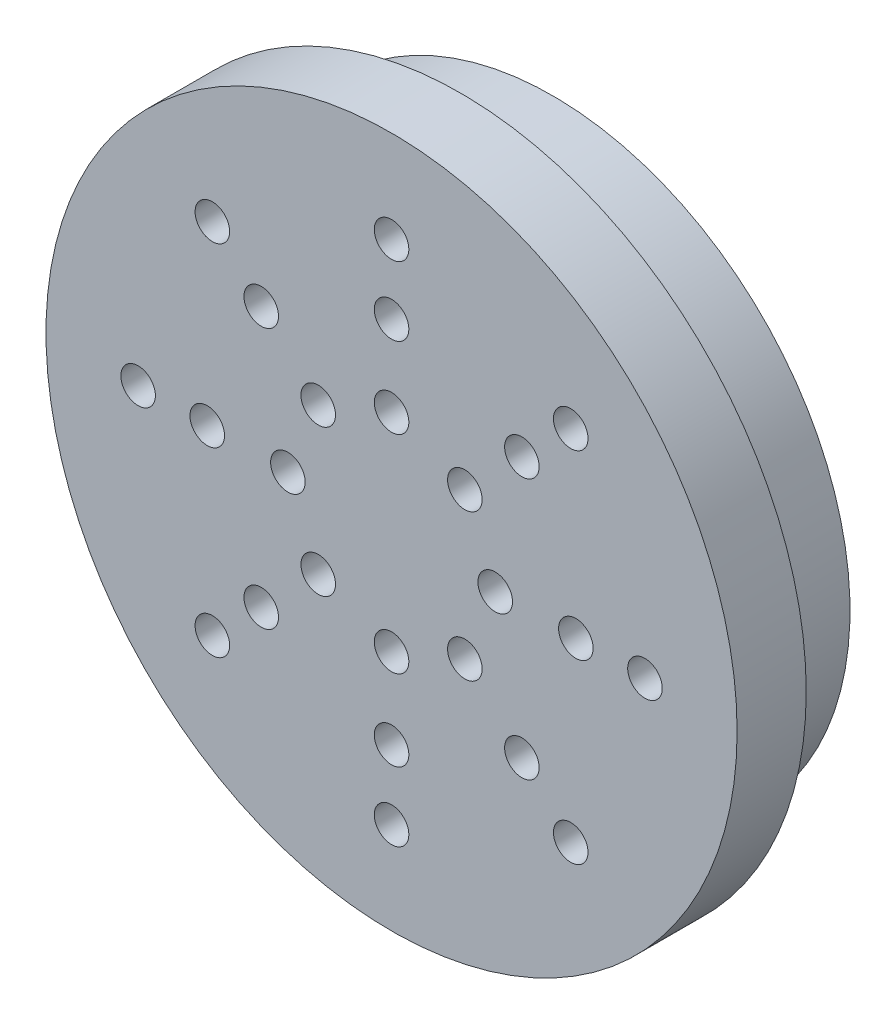
ISO-10303-21;
HEADER;
FILE_DESCRIPTION(('STEP AP214'),'2;1');
FILE_NAME('part.step','',(''),(''),'','','');
FILE_SCHEMA(('AUTOMOTIVE_DESIGN { 1 0 10303 214 1 1 1 1 }'));
ENDSEC;
DATA;
#1=APPLICATION_CONTEXT('core data for automotive mechanical design processes');
#2=APPLICATION_PROTOCOL_DEFINITION('international standard','automotive_design',2000,#1);
#3=PRODUCT_CONTEXT('',#1,'mechanical');
#4=PRODUCT('Part','Part','',(#3));
#5=PRODUCT_RELATED_PRODUCT_CATEGORY('part','',(#4));
#6=PRODUCT_DEFINITION_FORMATION('','',#4);
#7=PRODUCT_DEFINITION_CONTEXT('part definition',#1,'design');
#8=PRODUCT_DEFINITION('design','',#6,#7);
#9=PRODUCT_DEFINITION_SHAPE('','',#8);
#10=(LENGTH_UNIT() NAMED_UNIT(*) SI_UNIT(.MILLI.,.METRE.));
#11=(NAMED_UNIT(*) PLANE_ANGLE_UNIT() SI_UNIT($,.RADIAN.));
#12=(NAMED_UNIT(*) SI_UNIT($,.STERADIAN.) SOLID_ANGLE_UNIT());
#13=UNCERTAINTY_MEASURE_WITH_UNIT(LENGTH_MEASURE(1.E-05),#10,'distance_accuracy_value','');
#14=(GEOMETRIC_REPRESENTATION_CONTEXT(3) GLOBAL_UNCERTAINTY_ASSIGNED_CONTEXT((#13)) GLOBAL_UNIT_ASSIGNED_CONTEXT((#10,
#11,#12)) REPRESENTATION_CONTEXT('',''));
#15=CARTESIAN_POINT('',(0.,0.,0.));
#16=DIRECTION('',(0.,0.,1.));
#17=DIRECTION('',(1.,0.,0.));
#18=AXIS2_PLACEMENT_3D('',#15,#16,#17);
#19=CARTESIAN_POINT('',(0.,0.,3.));
#20=DIRECTION('',(0.,0.,-1.));
#21=DIRECTION('',(-1.,0.,0.));
#22=AXIS2_PLACEMENT_3D('',#19,#20,#21);
#23=CYLINDRICAL_SURFACE('',#22,15.);
#24=CARTESIAN_POINT('',(0.,0.,3.));
#25=DIRECTION('',(0.,0.,1.));
#26=DIRECTION('',(1.,0.,0.));
#27=AXIS2_PLACEMENT_3D('',#24,#25,#26);
#28=CIRCLE('',#27,15.);
#29=CARTESIAN_POINT('',(15.,0.,3.));
#30=VERTEX_POINT('',#29);
#31=EDGE_CURVE('E37',#30,#30,#28,.T.);
#32=ORIENTED_EDGE('',*,*,#31,.F.);
#33=EDGE_LOOP('',(#32));
#34=FACE_BOUND('',#33,.T.);
#35=CARTESIAN_POINT('',(0.,0.,0.));
#36=DIRECTION('',(0.,0.,1.));
#37=DIRECTION('',(1.,0.,0.));
#38=AXIS2_PLACEMENT_3D('',#35,#36,#37);
#39=CIRCLE('',#38,15.);
#40=CARTESIAN_POINT('',(15.,0.,0.));
#41=VERTEX_POINT('',#40);
#42=EDGE_CURVE('E33',#41,#41,#39,.T.);
#43=ORIENTED_EDGE('',*,*,#42,.T.);
#44=EDGE_LOOP('',(#43));
#45=FACE_BOUND('',#44,.T.);
#46=ADVANCED_FACE('F30',(#34,#45),#23,.T.);
#47=CARTESIAN_POINT('',(0.,0.,3.));
#48=DIRECTION('',(0.,0.,1.));
#49=DIRECTION('',(1.,0.,0.));
#50=AXIS2_PLACEMENT_3D('',#47,#48,#49);
#51=PLANE('',#50);
#52=CARTESIAN_POINT('',(-7.77817459305202,7.77817459305202,3.));
#53=DIRECTION('',(0.,0.,1.));
#54=DIRECTION('',(1.,0.,0.));
#55=AXIS2_PLACEMENT_3D('',#52,#53,#54);
#56=CIRCLE('',#55,0.749999999999998);
#57=CARTESIAN_POINT('',(-7.02817459305202,7.77817459305202,3.));
#58=VERTEX_POINT('',#57);
#59=EDGE_CURVE('E134',#58,#58,#56,.T.);
#60=ORIENTED_EDGE('',*,*,#59,.F.);
#61=EDGE_LOOP('',(#60));
#62=FACE_BOUND('',#61,.T.);
#63=CARTESIAN_POINT('',(0.,4.5,3.));
#64=DIRECTION('',(0.,0.,1.));
#65=DIRECTION('',(1.,0.,0.));
#66=AXIS2_PLACEMENT_3D('',#63,#64,#65);
#67=CIRCLE('',#66,0.75);
#68=CARTESIAN_POINT('',(0.75,4.5,3.));
#69=VERTEX_POINT('',#68);
#70=EDGE_CURVE('E127',#69,#69,#67,.T.);
#71=ORIENTED_EDGE('',*,*,#70,.F.);
#72=EDGE_LOOP('',(#71));
#73=FACE_BOUND('',#72,.T.);
#74=CARTESIAN_POINT('',(0.,8.,3.));
#75=DIRECTION('',(0.,0.,1.));
#76=DIRECTION('',(1.,0.,0.));
#77=AXIS2_PLACEMENT_3D('',#74,#75,#76);
#78=CIRCLE('',#77,0.75);
#79=CARTESIAN_POINT('',(0.749999999999999,8.,3.));
#80=VERTEX_POINT('',#79);
#81=EDGE_CURVE('E144',#80,#80,#78,.T.);
#82=ORIENTED_EDGE('',*,*,#81,.F.);
#83=EDGE_LOOP('',(#82));
#84=FACE_BOUND('',#83,.T.);
#85=CARTESIAN_POINT('',(0.,11.,3.));
#86=DIRECTION('',(0.,0.,1.));
#87=DIRECTION('',(1.,0.,0.));
#88=AXIS2_PLACEMENT_3D('',#85,#86,#87);
#89=CIRCLE('',#88,0.75);
#90=CARTESIAN_POINT('',(0.75,11.,3.));
#91=VERTEX_POINT('',#90);
#92=EDGE_CURVE('E66',#91,#91,#89,.T.);
#93=ORIENTED_EDGE('',*,*,#92,.F.);
#94=EDGE_LOOP('',(#93));
#95=FACE_BOUND('',#94,.T.);
#96=CARTESIAN_POINT('',(-5.65685424949238,5.65685424949238,3.));
#97=DIRECTION('',(0.,0.,1.));
#98=DIRECTION('',(1.,0.,0.));
#99=AXIS2_PLACEMENT_3D('',#96,#97,#98);
#100=CIRCLE('',#99,0.750000000000001);
#101=CARTESIAN_POINT('',(-4.90685424949238,5.65685424949238,3.));
#102=VERTEX_POINT('',#101);
#103=EDGE_CURVE('E103',#102,#102,#100,.T.);
#104=ORIENTED_EDGE('',*,*,#103,.F.);
#105=EDGE_LOOP('',(#104));
#106=FACE_BOUND('',#105,.T.);
#107=CARTESIAN_POINT('',(-3.18198051533946,3.18198051533946,3.));
#108=DIRECTION('',(0.,0.,1.));
#109=DIRECTION('',(1.,0.,0.));
#110=AXIS2_PLACEMENT_3D('',#107,#108,#109);
#111=CIRCLE('',#110,0.75);
#112=CARTESIAN_POINT('',(-2.43198051533946,3.18198051533946,3.));
#113=VERTEX_POINT('',#112);
#114=EDGE_CURVE('E110',#113,#113,#111,.T.);
#115=ORIENTED_EDGE('',*,*,#114,.F.);
#116=EDGE_LOOP('',(#115));
#117=FACE_BOUND('',#116,.T.);
#118=CARTESIAN_POINT('',(-11.,0.,3.));
#119=DIRECTION('',(0.,0.,1.));
#120=DIRECTION('',(1.,0.,0.));
#121=AXIS2_PLACEMENT_3D('',#118,#119,#120);
#122=CIRCLE('',#121,0.75);
#123=CARTESIAN_POINT('',(-10.25,0.,3.));
#124=VERTEX_POINT('',#123);
#125=EDGE_CURVE('E116',#124,#124,#122,.T.);
#126=ORIENTED_EDGE('',*,*,#125,.F.);
#127=EDGE_LOOP('',(#126));
#128=FACE_BOUND('',#127,.T.);
#129=CARTESIAN_POINT('',(-8.,0.,3.));
#130=DIRECTION('',(0.,0.,1.));
#131=DIRECTION('',(1.,0.,0.));
#132=AXIS2_PLACEMENT_3D('',#129,#130,#131);
#133=CIRCLE('',#132,0.749999999999998);
#134=CARTESIAN_POINT('',(-7.25,0.,3.));
#135=VERTEX_POINT('',#134);
#136=EDGE_CURVE('E122',#135,#135,#133,.T.);
#137=ORIENTED_EDGE('',*,*,#136,.F.);
#138=EDGE_LOOP('',(#137));
#139=FACE_BOUND('',#138,.T.);
#140=CARTESIAN_POINT('',(5.65685424949238,-5.65685424949238,3.));
#141=DIRECTION('',(0.,0.,1.));
#142=DIRECTION('',(1.,0.,0.));
#143=AXIS2_PLACEMENT_3D('',#140,#141,#142);
#144=CIRCLE('',#143,0.750000000000001);
#145=CARTESIAN_POINT('',(6.40685424949238,-5.65685424949238,3.));
#146=VERTEX_POINT('',#145);
#147=EDGE_CURVE('E79',#146,#146,#144,.T.);
#148=ORIENTED_EDGE('',*,*,#147,.F.);
#149=EDGE_LOOP('',(#148));
#150=FACE_BOUND('',#149,.T.);
#151=CARTESIAN_POINT('',(3.18198051533946,-3.18198051533946,3.));
#152=DIRECTION('',(0.,0.,1.));
#153=DIRECTION('',(1.,0.,0.));
#154=AXIS2_PLACEMENT_3D('',#151,#152,#153);
#155=CIRCLE('',#154,0.75);
#156=CARTESIAN_POINT('',(3.93198051533946,-3.18198051533946,3.));
#157=VERTEX_POINT('',#156);
#158=EDGE_CURVE('E86',#157,#157,#155,.T.);
#159=ORIENTED_EDGE('',*,*,#158,.F.);
#160=EDGE_LOOP('',(#159));
#161=FACE_BOUND('',#160,.T.);
#162=CARTESIAN_POINT('',(11.,0.,3.));
#163=DIRECTION('',(0.,0.,1.));
#164=DIRECTION('',(1.,0.,0.));
#165=AXIS2_PLACEMENT_3D('',#162,#163,#164);
#166=CIRCLE('',#165,0.75);
#167=CARTESIAN_POINT('',(11.75,0.,3.));
#168=VERTEX_POINT('',#167);
#169=EDGE_CURVE('E92',#168,#168,#166,.T.);
#170=ORIENTED_EDGE('',*,*,#169,.F.);
#171=EDGE_LOOP('',(#170));
#172=FACE_BOUND('',#171,.T.);
#173=CARTESIAN_POINT('',(8.,0.,3.));
#174=DIRECTION('',(0.,0.,1.));
#175=DIRECTION('',(1.,0.,0.));
#176=AXIS2_PLACEMENT_3D('',#173,#174,#175);
#177=CIRCLE('',#176,0.749999999999998);
#178=CARTESIAN_POINT('',(8.75,0.,3.));
#179=VERTEX_POINT('',#178);
#180=EDGE_CURVE('E98',#179,#179,#177,.T.);
#181=ORIENTED_EDGE('',*,*,#180,.F.);
#182=EDGE_LOOP('',(#181));
#183=FACE_BOUND('',#182,.T.);
#184=CARTESIAN_POINT('',(3.18198051533946,3.18198051533946,3.));
#185=DIRECTION('',(0.,0.,1.));
#186=DIRECTION('',(1.,0.,0.));
#187=AXIS2_PLACEMENT_3D('',#184,#185,#186);
#188=CIRCLE('',#187,0.75);
#189=CARTESIAN_POINT('',(3.93198051533946,3.18198051533946,3.));
#190=VERTEX_POINT('',#189);
#191=EDGE_CURVE('E60',#190,#190,#188,.T.);
#192=ORIENTED_EDGE('',*,*,#191,.F.);
#193=EDGE_LOOP('',(#192));
#194=FACE_BOUND('',#193,.T.);
#195=CARTESIAN_POINT('',(5.65685424949238,5.65685424949238,3.));
#196=DIRECTION('',(0.,0.,1.));
#197=DIRECTION('',(1.,0.,0.));
#198=AXIS2_PLACEMENT_3D('',#195,#196,#197);
#199=CIRCLE('',#198,0.749999999999998);
#200=CARTESIAN_POINT('',(6.40685424949238,5.65685424949238,3.));
#201=VERTEX_POINT('',#200);
#202=EDGE_CURVE('E53',#201,#201,#199,.T.);
#203=ORIENTED_EDGE('',*,*,#202,.F.);
#204=EDGE_LOOP('',(#203));
#205=FACE_BOUND('',#204,.T.);
#206=CARTESIAN_POINT('',(7.77817459305202,7.77817459305202,3.));
#207=DIRECTION('',(0.,0.,1.));
#208=DIRECTION('',(1.,0.,0.));
#209=AXIS2_PLACEMENT_3D('',#206,#207,#208);
#210=CIRCLE('',#209,0.75);
#211=CARTESIAN_POINT('',(8.52817459305202,7.77817459305202,3.));
#212=VERTEX_POINT('',#211);
#213=EDGE_CURVE('E74',#212,#212,#210,.T.);
#214=ORIENTED_EDGE('',*,*,#213,.F.);
#215=EDGE_LOOP('',(#214));
#216=FACE_BOUND('',#215,.T.);
#217=CARTESIAN_POINT('',(4.5,0.,3.));
#218=DIRECTION('',(0.,0.,1.));
#219=DIRECTION('',(1.,0.,0.));
#220=AXIS2_PLACEMENT_3D('',#217,#218,#219);
#221=CIRCLE('',#220,0.749999999999999);
#222=CARTESIAN_POINT('',(5.25,0.,3.));
#223=VERTEX_POINT('',#222);
#224=EDGE_CURVE('E67',#223,#223,#221,.T.);
#225=ORIENTED_EDGE('',*,*,#224,.F.);
#226=EDGE_LOOP('',(#225));
#227=FACE_BOUND('',#226,.T.);
#228=CARTESIAN_POINT('',(0.,-11.,3.));
#229=DIRECTION('',(0.,0.,1.));
#230=DIRECTION('',(1.,0.,0.));
#231=AXIS2_PLACEMENT_3D('',#228,#229,#230);
#232=CIRCLE('',#231,0.750000000000001);
#233=CARTESIAN_POINT('',(0.750000000000003,-11.,3.));
#234=VERTEX_POINT('',#233);
#235=EDGE_CURVE('E167',#234,#234,#232,.T.);
#236=ORIENTED_EDGE('',*,*,#235,.F.);
#237=EDGE_LOOP('',(#236));
#238=FACE_BOUND('',#237,.T.);
#239=CARTESIAN_POINT('',(0.,-8.,3.));
#240=DIRECTION('',(0.,0.,1.));
#241=DIRECTION('',(1.,0.,0.));
#242=AXIS2_PLACEMENT_3D('',#239,#240,#241);
#243=CIRCLE('',#242,0.75);
#244=CARTESIAN_POINT('',(0.750000000000001,-8.,3.));
#245=VERTEX_POINT('',#244);
#246=EDGE_CURVE('E185',#245,#245,#243,.T.);
#247=ORIENTED_EDGE('',*,*,#246,.F.);
#248=EDGE_LOOP('',(#247));
#249=FACE_BOUND('',#248,.T.);
#250=CARTESIAN_POINT('',(0.,-4.5,3.));
#251=DIRECTION('',(0.,0.,1.));
#252=DIRECTION('',(1.,0.,0.));
#253=AXIS2_PLACEMENT_3D('',#250,#251,#252);
#254=CIRCLE('',#253,0.75);
#255=CARTESIAN_POINT('',(0.750000000000001,-4.5,3.));
#256=VERTEX_POINT('',#255);
#257=EDGE_CURVE('E168',#256,#256,#254,.T.);
#258=ORIENTED_EDGE('',*,*,#257,.F.);
#259=EDGE_LOOP('',(#258));
#260=FACE_BOUND('',#259,.T.);
#261=CARTESIAN_POINT('',(7.77817459305202,-7.77817459305202,3.));
#262=DIRECTION('',(0.,0.,1.));
#263=DIRECTION('',(1.,0.,0.));
#264=AXIS2_PLACEMENT_3D('',#261,#262,#263);
#265=CIRCLE('',#264,0.749999999999998);
#266=CARTESIAN_POINT('',(8.52817459305202,-7.77817459305202,3.));
#267=VERTEX_POINT('',#266);
#268=EDGE_CURVE('E175',#267,#267,#265,.T.);
#269=ORIENTED_EDGE('',*,*,#268,.F.);
#270=EDGE_LOOP('',(#269));
#271=FACE_BOUND('',#270,.T.);
#272=CARTESIAN_POINT('',(-3.18198051533946,-3.18198051533946,3.));
#273=DIRECTION('',(0.,0.,1.));
#274=DIRECTION('',(1.,0.,0.));
#275=AXIS2_PLACEMENT_3D('',#272,#273,#274);
#276=CIRCLE('',#275,0.75);
#277=CARTESIAN_POINT('',(-2.43198051533946,-3.18198051533946,3.));
#278=VERTEX_POINT('',#277);
#279=EDGE_CURVE('E161',#278,#278,#276,.T.);
#280=ORIENTED_EDGE('',*,*,#279,.F.);
#281=EDGE_LOOP('',(#280));
#282=FACE_BOUND('',#281,.T.);
#283=CARTESIAN_POINT('',(-5.65685424949238,-5.65685424949238,3.));
#284=DIRECTION('',(0.,0.,1.));
#285=DIRECTION('',(1.,0.,0.));
#286=AXIS2_PLACEMENT_3D('',#283,#284,#285);
#287=CIRCLE('',#286,0.750000000000001);
#288=CARTESIAN_POINT('',(-4.90685424949238,-5.65685424949238,3.));
#289=VERTEX_POINT('',#288);
#290=EDGE_CURVE('E155',#289,#289,#287,.T.);
#291=ORIENTED_EDGE('',*,*,#290,.F.);
#292=EDGE_LOOP('',(#291));
#293=FACE_BOUND('',#292,.T.);
#294=CARTESIAN_POINT('',(-7.77817459305202,-7.77817459305202,3.));
#295=DIRECTION('',(0.,0.,1.));
#296=DIRECTION('',(1.,0.,0.));
#297=AXIS2_PLACEMENT_3D('',#294,#295,#296);
#298=CIRCLE('',#297,0.750000000000001);
#299=CARTESIAN_POINT('',(-7.02817459305202,-7.77817459305202,3.));
#300=VERTEX_POINT('',#299);
#301=EDGE_CURVE('E149',#300,#300,#298,.T.);
#302=ORIENTED_EDGE('',*,*,#301,.F.);
#303=EDGE_LOOP('',(#302));
#304=FACE_BOUND('',#303,.T.);
#305=CARTESIAN_POINT('',(-4.5,0.,3.));
#306=DIRECTION('',(0.,0.,1.));
#307=DIRECTION('',(1.,0.,0.));
#308=AXIS2_PLACEMENT_3D('',#305,#306,#307);
#309=CIRCLE('',#308,0.75);
#310=CARTESIAN_POINT('',(-3.75,0.,3.));
#311=VERTEX_POINT('',#310);
#312=EDGE_CURVE('E47',#311,#311,#309,.T.);
#313=ORIENTED_EDGE('',*,*,#312,.F.);
#314=EDGE_LOOP('',(#313));
#315=FACE_BOUND('',#314,.T.);
#316=ORIENTED_EDGE('',*,*,#31,.T.);
#317=EDGE_LOOP('',(#316));
#318=FACE_BOUND('',#317,.T.);
#319=ADVANCED_FACE('F202',(#62,#73,#84,#95,#106,#117,#128,#139,#150,#161,#172,#183,#194,#205,
#216,#227,#238,#249,#260,#271,#282,#293,#304,#315,#318),#51,.T.);
#320=CARTESIAN_POINT('',(0.,0.,0.));
#321=DIRECTION('',(0.,0.,1.));
#322=DIRECTION('',(1.,0.,0.));
#323=AXIS2_PLACEMENT_3D('',#320,#321,#322);
#324=PLANE('',#323);
#325=CARTESIAN_POINT('',(0.,0.,0.));
#326=DIRECTION('',(0.,0.,-1.));
#327=DIRECTION('',(-1.,0.,0.));
#328=AXIS2_PLACEMENT_3D('',#325,#326,#327);
#329=CIRCLE('',#328,12.9);
#330=CARTESIAN_POINT('',(-12.9,0.,0.));
#331=VERTEX_POINT('',#330);
#332=EDGE_CURVE('E10',#331,#331,#329,.T.);
#333=ORIENTED_EDGE('',*,*,#332,.F.);
#334=EDGE_LOOP('',(#333));
#335=FACE_BOUND('',#334,.T.);
#336=ORIENTED_EDGE('',*,*,#42,.F.);
#337=EDGE_LOOP('',(#336));
#338=FACE_BOUND('',#337,.T.);
#339=ADVANCED_FACE('F205',(#335,#338),#324,.F.);
#340=CARTESIAN_POINT('',(0.,0.,-4.));
#341=DIRECTION('',(0.,0.,1.));
#342=DIRECTION('',(1.,0.,0.));
#343=AXIS2_PLACEMENT_3D('',#340,#341,#342);
#344=CYLINDRICAL_SURFACE('',#343,12.9);
#345=CARTESIAN_POINT('',(0.,0.,-4.));
#346=DIRECTION('',(0.,0.,-1.));
#347=DIRECTION('',(-1.,0.,0.));
#348=AXIS2_PLACEMENT_3D('',#345,#346,#347);
#349=CIRCLE('',#348,12.9);
#350=CARTESIAN_POINT('',(-12.9,0.,-4.));
#351=VERTEX_POINT('',#350);
#352=EDGE_CURVE('E43',#351,#351,#349,.T.);
#353=ORIENTED_EDGE('',*,*,#352,.F.);
#354=EDGE_LOOP('',(#353));
#355=FACE_BOUND('',#354,.T.);
#356=ORIENTED_EDGE('',*,*,#332,.T.);
#357=EDGE_LOOP('',(#356));
#358=FACE_BOUND('',#357,.T.);
#359=ADVANCED_FACE('F228',(#355,#358),#344,.T.);
#360=CARTESIAN_POINT('',(0.,0.,-4.));
#361=DIRECTION('',(0.,0.,-1.));
#362=DIRECTION('',(-1.,0.,0.));
#363=AXIS2_PLACEMENT_3D('',#360,#361,#362);
#364=PLANE('',#363);
#365=CARTESIAN_POINT('',(-7.77817459305202,7.77817459305202,-4.));
#366=DIRECTION('',(0.,0.,1.));
#367=DIRECTION('',(1.,0.,0.));
#368=AXIS2_PLACEMENT_3D('',#365,#366,#367);
#369=CIRCLE('',#368,0.749999999999998);
#370=CARTESIAN_POINT('',(-7.02817459305202,7.77817459305202,-4.));
#371=VERTEX_POINT('',#370);
#372=EDGE_CURVE('E107',#371,#371,#369,.T.);
#373=ORIENTED_EDGE('',*,*,#372,.T.);
#374=EDGE_LOOP('',(#373));
#375=FACE_BOUND('',#374,.T.);
#376=CARTESIAN_POINT('',(0.,4.5,-4.));
#377=DIRECTION('',(0.,0.,1.));
#378=DIRECTION('',(1.,0.,0.));
#379=AXIS2_PLACEMENT_3D('',#376,#377,#378);
#380=CIRCLE('',#379,0.75);
#381=CARTESIAN_POINT('',(0.75,4.5,-4.));
#382=VERTEX_POINT('',#381);
#383=EDGE_CURVE('E130',#382,#382,#380,.T.);
#384=ORIENTED_EDGE('',*,*,#383,.T.);
#385=EDGE_LOOP('',(#384));
#386=FACE_BOUND('',#385,.T.);
#387=CARTESIAN_POINT('',(0.,8.,-4.));
#388=DIRECTION('',(0.,0.,1.));
#389=DIRECTION('',(1.,0.,0.));
#390=AXIS2_PLACEMENT_3D('',#387,#388,#389);
#391=CIRCLE('',#390,0.75);
#392=CARTESIAN_POINT('',(0.749999999999999,8.,-4.));
#393=VERTEX_POINT('',#392);
#394=EDGE_CURVE('E131',#393,#393,#391,.T.);
#395=ORIENTED_EDGE('',*,*,#394,.T.);
#396=EDGE_LOOP('',(#395));
#397=FACE_BOUND('',#396,.T.);
#398=CARTESIAN_POINT('',(0.,11.,-4.));
#399=DIRECTION('',(0.,0.,1.));
#400=DIRECTION('',(1.,0.,0.));
#401=AXIS2_PLACEMENT_3D('',#398,#399,#400);
#402=CIRCLE('',#401,0.75);
#403=CARTESIAN_POINT('',(0.75,11.,-4.));
#404=VERTEX_POINT('',#403);
#405=EDGE_CURVE('E141',#404,#404,#402,.T.);
#406=ORIENTED_EDGE('',*,*,#405,.T.);
#407=EDGE_LOOP('',(#406));
#408=FACE_BOUND('',#407,.T.);
#409=CARTESIAN_POINT('',(-5.65685424949238,5.65685424949238,-4.));
#410=DIRECTION('',(0.,0.,1.));
#411=DIRECTION('',(1.,0.,0.));
#412=AXIS2_PLACEMENT_3D('',#409,#410,#411);
#413=CIRCLE('',#412,0.750000000000001);
#414=CARTESIAN_POINT('',(-4.90685424949238,5.65685424949238,-4.));
#415=VERTEX_POINT('',#414);
#416=EDGE_CURVE('E106',#415,#415,#413,.T.);
#417=ORIENTED_EDGE('',*,*,#416,.T.);
#418=EDGE_LOOP('',(#417));
#419=FACE_BOUND('',#418,.T.);
#420=CARTESIAN_POINT('',(-3.18198051533946,3.18198051533946,-4.));
#421=DIRECTION('',(0.,0.,1.));
#422=DIRECTION('',(1.,0.,0.));
#423=AXIS2_PLACEMENT_3D('',#420,#421,#422);
#424=CIRCLE('',#423,0.75);
#425=CARTESIAN_POINT('',(-2.43198051533946,3.18198051533946,-4.));
#426=VERTEX_POINT('',#425);
#427=EDGE_CURVE('E113',#426,#426,#424,.T.);
#428=ORIENTED_EDGE('',*,*,#427,.T.);
#429=EDGE_LOOP('',(#428));
#430=FACE_BOUND('',#429,.T.);
#431=CARTESIAN_POINT('',(-11.,0.,-4.));
#432=DIRECTION('',(0.,0.,1.));
#433=DIRECTION('',(1.,0.,0.));
#434=AXIS2_PLACEMENT_3D('',#431,#432,#433);
#435=CIRCLE('',#434,0.75);
#436=CARTESIAN_POINT('',(-10.25,0.,-4.));
#437=VERTEX_POINT('',#436);
#438=EDGE_CURVE('E119',#437,#437,#435,.T.);
#439=ORIENTED_EDGE('',*,*,#438,.T.);
#440=EDGE_LOOP('',(#439));
#441=FACE_BOUND('',#440,.T.);
#442=CARTESIAN_POINT('',(-8.,0.,-4.));
#443=DIRECTION('',(0.,0.,1.));
#444=DIRECTION('',(1.,0.,0.));
#445=AXIS2_PLACEMENT_3D('',#442,#443,#444);
#446=CIRCLE('',#445,0.749999999999998);
#447=CARTESIAN_POINT('',(-7.25,0.,-4.));
#448=VERTEX_POINT('',#447);
#449=EDGE_CURVE('E50',#448,#448,#446,.T.);
#450=ORIENTED_EDGE('',*,*,#449,.T.);
#451=EDGE_LOOP('',(#450));
#452=FACE_BOUND('',#451,.T.);
#453=CARTESIAN_POINT('',(5.65685424949238,-5.65685424949238,-4.));
#454=DIRECTION('',(0.,0.,1.));
#455=DIRECTION('',(1.,0.,0.));
#456=AXIS2_PLACEMENT_3D('',#453,#454,#455);
#457=CIRCLE('',#456,0.750000000000001);
#458=CARTESIAN_POINT('',(6.40685424949238,-5.65685424949238,-4.));
#459=VERTEX_POINT('',#458);
#460=EDGE_CURVE('E82',#459,#459,#457,.T.);
#461=ORIENTED_EDGE('',*,*,#460,.T.);
#462=EDGE_LOOP('',(#461));
#463=FACE_BOUND('',#462,.T.);
#464=CARTESIAN_POINT('',(3.18198051533946,-3.18198051533946,-4.));
#465=DIRECTION('',(0.,0.,1.));
#466=DIRECTION('',(1.,0.,0.));
#467=AXIS2_PLACEMENT_3D('',#464,#465,#466);
#468=CIRCLE('',#467,0.75);
#469=CARTESIAN_POINT('',(3.93198051533946,-3.18198051533946,-4.));
#470=VERTEX_POINT('',#469);
#471=EDGE_CURVE('E89',#470,#470,#468,.T.);
#472=ORIENTED_EDGE('',*,*,#471,.T.);
#473=EDGE_LOOP('',(#472));
#474=FACE_BOUND('',#473,.T.);
#475=CARTESIAN_POINT('',(11.,0.,-4.));
#476=DIRECTION('',(0.,0.,1.));
#477=DIRECTION('',(1.,0.,0.));
#478=AXIS2_PLACEMENT_3D('',#475,#476,#477);
#479=CIRCLE('',#478,0.75);
#480=CARTESIAN_POINT('',(11.75,0.,-4.));
#481=VERTEX_POINT('',#480);
#482=EDGE_CURVE('E95',#481,#481,#479,.T.);
#483=ORIENTED_EDGE('',*,*,#482,.T.);
#484=EDGE_LOOP('',(#483));
#485=FACE_BOUND('',#484,.T.);
#486=CARTESIAN_POINT('',(8.,0.,-4.));
#487=DIRECTION('',(0.,0.,1.));
#488=DIRECTION('',(1.,0.,0.));
#489=AXIS2_PLACEMENT_3D('',#486,#487,#488);
#490=CIRCLE('',#489,0.749999999999998);
#491=CARTESIAN_POINT('',(8.75,0.,-4.));
#492=VERTEX_POINT('',#491);
#493=EDGE_CURVE('E71',#492,#492,#490,.T.);
#494=ORIENTED_EDGE('',*,*,#493,.T.);
#495=EDGE_LOOP('',(#494));
#496=FACE_BOUND('',#495,.T.);
#497=CARTESIAN_POINT('',(3.18198051533946,3.18198051533946,-4.));
#498=DIRECTION('',(0.,0.,1.));
#499=DIRECTION('',(1.,0.,0.));
#500=AXIS2_PLACEMENT_3D('',#497,#498,#499);
#501=CIRCLE('',#500,0.75);
#502=CARTESIAN_POINT('',(3.93198051533946,3.18198051533946,-4.));
#503=VERTEX_POINT('',#502);
#504=EDGE_CURVE('E63',#503,#503,#501,.T.);
#505=ORIENTED_EDGE('',*,*,#504,.T.);
#506=EDGE_LOOP('',(#505));
#507=FACE_BOUND('',#506,.T.);
#508=CARTESIAN_POINT('',(5.65685424949238,5.65685424949238,-4.));
#509=DIRECTION('',(0.,0.,1.));
#510=DIRECTION('',(1.,0.,0.));
#511=AXIS2_PLACEMENT_3D('',#508,#509,#510);
#512=CIRCLE('',#511,0.749999999999998);
#513=CARTESIAN_POINT('',(6.40685424949238,5.65685424949238,-4.));
#514=VERTEX_POINT('',#513);
#515=EDGE_CURVE('E56',#514,#514,#512,.T.);
#516=ORIENTED_EDGE('',*,*,#515,.T.);
#517=EDGE_LOOP('',(#516));
#518=FACE_BOUND('',#517,.T.);
#519=CARTESIAN_POINT('',(7.77817459305202,7.77817459305202,-4.));
#520=DIRECTION('',(0.,0.,1.));
#521=DIRECTION('',(1.,0.,0.));
#522=AXIS2_PLACEMENT_3D('',#519,#520,#521);
#523=CIRCLE('',#522,0.75);
#524=CARTESIAN_POINT('',(8.52817459305202,7.77817459305202,-4.));
#525=VERTEX_POINT('',#524);
#526=EDGE_CURVE('E57',#525,#525,#523,.T.);
#527=ORIENTED_EDGE('',*,*,#526,.T.);
#528=EDGE_LOOP('',(#527));
#529=FACE_BOUND('',#528,.T.);
#530=CARTESIAN_POINT('',(4.5,0.,-4.));
#531=DIRECTION('',(0.,0.,1.));
#532=DIRECTION('',(1.,0.,0.));
#533=AXIS2_PLACEMENT_3D('',#530,#531,#532);
#534=CIRCLE('',#533,0.749999999999999);
#535=CARTESIAN_POINT('',(5.25,0.,-4.));
#536=VERTEX_POINT('',#535);
#537=EDGE_CURVE('E70',#536,#536,#534,.T.);
#538=ORIENTED_EDGE('',*,*,#537,.T.);
#539=EDGE_LOOP('',(#538));
#540=FACE_BOUND('',#539,.T.);
#541=CARTESIAN_POINT('',(0.,-11.,-4.));
#542=DIRECTION('',(0.,0.,1.));
#543=DIRECTION('',(1.,0.,0.));
#544=AXIS2_PLACEMENT_3D('',#541,#542,#543);
#545=CIRCLE('',#544,0.750000000000001);
#546=CARTESIAN_POINT('',(0.750000000000003,-11.,-4.));
#547=VERTEX_POINT('',#546);
#548=EDGE_CURVE('E182',#547,#547,#545,.T.);
#549=ORIENTED_EDGE('',*,*,#548,.T.);
#550=EDGE_LOOP('',(#549));
#551=FACE_BOUND('',#550,.T.);
#552=CARTESIAN_POINT('',(0.,-8.,-4.));
#553=DIRECTION('',(0.,0.,1.));
#554=DIRECTION('',(1.,0.,0.));
#555=AXIS2_PLACEMENT_3D('',#552,#553,#554);
#556=CIRCLE('',#555,0.75);
#557=CARTESIAN_POINT('',(0.750000000000001,-8.,-4.));
#558=VERTEX_POINT('',#557);
#559=EDGE_CURVE('E172',#558,#558,#556,.T.);
#560=ORIENTED_EDGE('',*,*,#559,.T.);
#561=EDGE_LOOP('',(#560));
#562=FACE_BOUND('',#561,.T.);
#563=CARTESIAN_POINT('',(0.,-4.5,-4.));
#564=DIRECTION('',(0.,0.,1.));
#565=DIRECTION('',(1.,0.,0.));
#566=AXIS2_PLACEMENT_3D('',#563,#564,#565);
#567=CIRCLE('',#566,0.75);
#568=CARTESIAN_POINT('',(0.750000000000001,-4.5,-4.));
#569=VERTEX_POINT('',#568);
#570=EDGE_CURVE('E171',#569,#569,#567,.T.);
#571=ORIENTED_EDGE('',*,*,#570,.T.);
#572=EDGE_LOOP('',(#571));
#573=FACE_BOUND('',#572,.T.);
#574=CARTESIAN_POINT('',(7.77817459305202,-7.77817459305202,-4.));
#575=DIRECTION('',(0.,0.,1.));
#576=DIRECTION('',(1.,0.,0.));
#577=AXIS2_PLACEMENT_3D('',#574,#575,#576);
#578=CIRCLE('',#577,0.749999999999998);
#579=CARTESIAN_POINT('',(8.52817459305202,-7.77817459305202,-4.));
#580=VERTEX_POINT('',#579);
#581=EDGE_CURVE('E83',#580,#580,#578,.T.);
#582=ORIENTED_EDGE('',*,*,#581,.T.);
#583=EDGE_LOOP('',(#582));
#584=FACE_BOUND('',#583,.T.);
#585=CARTESIAN_POINT('',(-3.18198051533946,-3.18198051533946,-4.));
#586=DIRECTION('',(0.,0.,1.));
#587=DIRECTION('',(1.,0.,0.));
#588=AXIS2_PLACEMENT_3D('',#585,#586,#587);
#589=CIRCLE('',#588,0.75);
#590=CARTESIAN_POINT('',(-2.43198051533946,-3.18198051533946,-4.));
#591=VERTEX_POINT('',#590);
#592=EDGE_CURVE('E164',#591,#591,#589,.T.);
#593=ORIENTED_EDGE('',*,*,#592,.T.);
#594=EDGE_LOOP('',(#593));
#595=FACE_BOUND('',#594,.T.);
#596=CARTESIAN_POINT('',(-5.65685424949238,-5.65685424949238,-4.));
#597=DIRECTION('',(0.,0.,1.));
#598=DIRECTION('',(1.,0.,0.));
#599=AXIS2_PLACEMENT_3D('',#596,#597,#598);
#600=CIRCLE('',#599,0.750000000000001);
#601=CARTESIAN_POINT('',(-4.90685424949238,-5.65685424949238,-4.));
#602=VERTEX_POINT('',#601);
#603=EDGE_CURVE('E158',#602,#602,#600,.T.);
#604=ORIENTED_EDGE('',*,*,#603,.T.);
#605=EDGE_LOOP('',(#604));
#606=FACE_BOUND('',#605,.T.);
#607=CARTESIAN_POINT('',(-7.77817459305202,-7.77817459305202,-4.));
#608=DIRECTION('',(0.,0.,1.));
#609=DIRECTION('',(1.,0.,0.));
#610=AXIS2_PLACEMENT_3D('',#607,#608,#609);
#611=CIRCLE('',#610,0.750000000000001);
#612=CARTESIAN_POINT('',(-7.02817459305202,-7.77817459305202,-4.));
#613=VERTEX_POINT('',#612);
#614=EDGE_CURVE('E152',#613,#613,#611,.T.);
#615=ORIENTED_EDGE('',*,*,#614,.T.);
#616=EDGE_LOOP('',(#615));
#617=FACE_BOUND('',#616,.T.);
#618=CARTESIAN_POINT('',(-4.5,0.,-4.));
#619=DIRECTION('',(0.,0.,1.));
#620=DIRECTION('',(1.,0.,0.));
#621=AXIS2_PLACEMENT_3D('',#618,#619,#620);
#622=CIRCLE('',#621,0.75);
#623=CARTESIAN_POINT('',(-3.75,0.,-4.));
#624=VERTEX_POINT('',#623);
#625=EDGE_CURVE('E46',#624,#624,#622,.T.);
#626=ORIENTED_EDGE('',*,*,#625,.T.);
#627=EDGE_LOOP('',(#626));
#628=FACE_BOUND('',#627,.T.);
#629=ORIENTED_EDGE('',*,*,#352,.T.);
#630=EDGE_LOOP('',(#629));
#631=FACE_BOUND('',#630,.T.);
#632=ADVANCED_FACE('F191',(#375,#386,#397,#408,#419,#430,#441,#452,#463,#474,#485,#496,#507,
#518,#529,#540,#551,#562,#573,#584,#595,#606,#617,#628,#631),#364,.T.);
#633=CARTESIAN_POINT('',(-4.5,0.,-4.));
#634=DIRECTION('',(0.,0.,1.));
#635=DIRECTION('',(1.,0.,0.));
#636=AXIS2_PLACEMENT_3D('',#633,#634,#635);
#637=CYLINDRICAL_SURFACE('',#636,0.75);
#638=ORIENTED_EDGE('',*,*,#625,.F.);
#639=EDGE_LOOP('',(#638));
#640=FACE_BOUND('',#639,.T.);
#641=ORIENTED_EDGE('',*,*,#312,.T.);
#642=EDGE_LOOP('',(#641));
#643=FACE_BOUND('',#642,.T.);
#644=ADVANCED_FACE('F238',(#640,#643),#637,.F.);
#645=CARTESIAN_POINT('',(-7.77817459305202,-7.77817459305202,-4.));
#646=DIRECTION('',(0.,0.,1.));
#647=DIRECTION('',(1.,0.,0.));
#648=AXIS2_PLACEMENT_3D('',#645,#646,#647);
#649=CYLINDRICAL_SURFACE('',#648,0.750000000000001);
#650=ORIENTED_EDGE('',*,*,#614,.F.);
#651=EDGE_LOOP('',(#650));
#652=FACE_BOUND('',#651,.T.);
#653=ORIENTED_EDGE('',*,*,#301,.T.);
#654=EDGE_LOOP('',(#653));
#655=FACE_BOUND('',#654,.T.);
#656=ADVANCED_FACE('F242',(#652,#655),#649,.F.);
#657=CARTESIAN_POINT('',(-5.65685424949238,-5.65685424949238,-4.));
#658=DIRECTION('',(0.,0.,1.));
#659=DIRECTION('',(1.,0.,0.));
#660=AXIS2_PLACEMENT_3D('',#657,#658,#659);
#661=CYLINDRICAL_SURFACE('',#660,0.750000000000001);
#662=ORIENTED_EDGE('',*,*,#603,.F.);
#663=EDGE_LOOP('',(#662));
#664=FACE_BOUND('',#663,.T.);
#665=ORIENTED_EDGE('',*,*,#290,.T.);
#666=EDGE_LOOP('',(#665));
#667=FACE_BOUND('',#666,.T.);
#668=ADVANCED_FACE('F310',(#664,#667),#661,.F.);
#669=CARTESIAN_POINT('',(-3.18198051533946,-3.18198051533946,-4.));
#670=DIRECTION('',(0.,0.,1.));
#671=DIRECTION('',(1.,0.,0.));
#672=AXIS2_PLACEMENT_3D('',#669,#670,#671);
#673=CYLINDRICAL_SURFACE('',#672,0.75);
#674=ORIENTED_EDGE('',*,*,#592,.F.);
#675=EDGE_LOOP('',(#674));
#676=FACE_BOUND('',#675,.T.);
#677=ORIENTED_EDGE('',*,*,#279,.T.);
#678=EDGE_LOOP('',(#677));
#679=FACE_BOUND('',#678,.T.);
#680=ADVANCED_FACE('F314',(#676,#679),#673,.F.);
#681=CARTESIAN_POINT('',(7.77817459305202,-7.77817459305202,-4.));
#682=DIRECTION('',(0.,0.,1.));
#683=DIRECTION('',(1.,0.,0.));
#684=AXIS2_PLACEMENT_3D('',#681,#682,#683);
#685=CYLINDRICAL_SURFACE('',#684,0.749999999999998);
#686=ORIENTED_EDGE('',*,*,#581,.F.);
#687=EDGE_LOOP('',(#686));
#688=FACE_BOUND('',#687,.T.);
#689=ORIENTED_EDGE('',*,*,#268,.T.);
#690=EDGE_LOOP('',(#689));
#691=FACE_BOUND('',#690,.T.);
#692=ADVANCED_FACE('F318',(#688,#691),#685,.F.);
#693=CARTESIAN_POINT('',(0.,-4.5,-4.));
#694=DIRECTION('',(0.,0.,1.));
#695=DIRECTION('',(1.,0.,0.));
#696=AXIS2_PLACEMENT_3D('',#693,#694,#695);
#697=CYLINDRICAL_SURFACE('',#696,0.75);
#698=ORIENTED_EDGE('',*,*,#570,.F.);
#699=EDGE_LOOP('',(#698));
#700=FACE_BOUND('',#699,.T.);
#701=ORIENTED_EDGE('',*,*,#257,.T.);
#702=EDGE_LOOP('',(#701));
#703=FACE_BOUND('',#702,.T.);
#704=ADVANCED_FACE('F198',(#700,#703),#697,.F.);
#705=CARTESIAN_POINT('',(0.,-8.,-4.));
#706=DIRECTION('',(0.,0.,1.));
#707=DIRECTION('',(1.,0.,0.));
#708=AXIS2_PLACEMENT_3D('',#705,#706,#707);
#709=CYLINDRICAL_SURFACE('',#708,0.75);
#710=ORIENTED_EDGE('',*,*,#559,.F.);
#711=EDGE_LOOP('',(#710));
#712=FACE_BOUND('',#711,.T.);
#713=ORIENTED_EDGE('',*,*,#246,.T.);
#714=EDGE_LOOP('',(#713));
#715=FACE_BOUND('',#714,.T.);
#716=ADVANCED_FACE('F194',(#712,#715),#709,.F.);
#717=CARTESIAN_POINT('',(0.,-11.,-4.));
#718=DIRECTION('',(0.,0.,1.));
#719=DIRECTION('',(1.,0.,0.));
#720=AXIS2_PLACEMENT_3D('',#717,#718,#719);
#721=CYLINDRICAL_SURFACE('',#720,0.750000000000001);
#722=ORIENTED_EDGE('',*,*,#548,.F.);
#723=EDGE_LOOP('',(#722));
#724=FACE_BOUND('',#723,.T.);
#725=ORIENTED_EDGE('',*,*,#235,.T.);
#726=EDGE_LOOP('',(#725));
#727=FACE_BOUND('',#726,.T.);
#728=ADVANCED_FACE('F197',(#724,#727),#721,.F.);
#729=CARTESIAN_POINT('',(4.5,0.,-4.));
#730=DIRECTION('',(0.,0.,1.));
#731=DIRECTION('',(1.,0.,0.));
#732=AXIS2_PLACEMENT_3D('',#729,#730,#731);
#733=CYLINDRICAL_SURFACE('',#732,0.749999999999999);
#734=ORIENTED_EDGE('',*,*,#537,.F.);
#735=EDGE_LOOP('',(#734));
#736=FACE_BOUND('',#735,.T.);
#737=ORIENTED_EDGE('',*,*,#224,.T.);
#738=EDGE_LOOP('',(#737));
#739=FACE_BOUND('',#738,.T.);
#740=ADVANCED_FACE('F254',(#736,#739),#733,.F.);
#741=CARTESIAN_POINT('',(7.77817459305202,7.77817459305202,-4.));
#742=DIRECTION('',(0.,0.,1.));
#743=DIRECTION('',(1.,0.,0.));
#744=AXIS2_PLACEMENT_3D('',#741,#742,#743);
#745=CYLINDRICAL_SURFACE('',#744,0.75);
#746=ORIENTED_EDGE('',*,*,#526,.F.);
#747=EDGE_LOOP('',(#746));
#748=FACE_BOUND('',#747,.T.);
#749=ORIENTED_EDGE('',*,*,#213,.T.);
#750=EDGE_LOOP('',(#749));
#751=FACE_BOUND('',#750,.T.);
#752=ADVANCED_FACE('F248',(#748,#751),#745,.F.);
#753=CARTESIAN_POINT('',(5.65685424949238,5.65685424949238,-4.));
#754=DIRECTION('',(0.,0.,1.));
#755=DIRECTION('',(1.,0.,0.));
#756=AXIS2_PLACEMENT_3D('',#753,#754,#755);
#757=CYLINDRICAL_SURFACE('',#756,0.749999999999998);
#758=ORIENTED_EDGE('',*,*,#515,.F.);
#759=EDGE_LOOP('',(#758));
#760=FACE_BOUND('',#759,.T.);
#761=ORIENTED_EDGE('',*,*,#202,.T.);
#762=EDGE_LOOP('',(#761));
#763=FACE_BOUND('',#762,.T.);
#764=ADVANCED_FACE('F244',(#760,#763),#757,.F.);
#765=CARTESIAN_POINT('',(3.18198051533946,3.18198051533946,-4.));
#766=DIRECTION('',(0.,0.,1.));
#767=DIRECTION('',(1.,0.,0.));
#768=AXIS2_PLACEMENT_3D('',#765,#766,#767);
#769=CYLINDRICAL_SURFACE('',#768,0.75);
#770=ORIENTED_EDGE('',*,*,#504,.F.);
#771=EDGE_LOOP('',(#770));
#772=FACE_BOUND('',#771,.T.);
#773=ORIENTED_EDGE('',*,*,#191,.T.);
#774=EDGE_LOOP('',(#773));
#775=FACE_BOUND('',#774,.T.);
#776=ADVANCED_FACE('F247',(#772,#775),#769,.F.);
#777=CARTESIAN_POINT('',(8.,0.,-4.));
#778=DIRECTION('',(0.,0.,1.));
#779=DIRECTION('',(1.,0.,0.));
#780=AXIS2_PLACEMENT_3D('',#777,#778,#779);
#781=CYLINDRICAL_SURFACE('',#780,0.749999999999998);
#782=ORIENTED_EDGE('',*,*,#493,.F.);
#783=EDGE_LOOP('',(#782));
#784=FACE_BOUND('',#783,.T.);
#785=ORIENTED_EDGE('',*,*,#180,.T.);
#786=EDGE_LOOP('',(#785));
#787=FACE_BOUND('',#786,.T.);
#788=ADVANCED_FACE('F252',(#784,#787),#781,.F.);
#789=CARTESIAN_POINT('',(11.,0.,-4.));
#790=DIRECTION('',(0.,0.,1.));
#791=DIRECTION('',(1.,0.,0.));
#792=AXIS2_PLACEMENT_3D('',#789,#790,#791);
#793=CYLINDRICAL_SURFACE('',#792,0.75);
#794=ORIENTED_EDGE('',*,*,#482,.F.);
#795=EDGE_LOOP('',(#794));
#796=FACE_BOUND('',#795,.T.);
#797=ORIENTED_EDGE('',*,*,#169,.T.);
#798=EDGE_LOOP('',(#797));
#799=FACE_BOUND('',#798,.T.);
#800=ADVANCED_FACE('F269',(#796,#799),#793,.F.);
#801=CARTESIAN_POINT('',(3.18198051533946,-3.18198051533946,-4.));
#802=DIRECTION('',(0.,0.,1.));
#803=DIRECTION('',(1.,0.,0.));
#804=AXIS2_PLACEMENT_3D('',#801,#802,#803);
#805=CYLINDRICAL_SURFACE('',#804,0.75);
#806=ORIENTED_EDGE('',*,*,#471,.F.);
#807=EDGE_LOOP('',(#806));
#808=FACE_BOUND('',#807,.T.);
#809=ORIENTED_EDGE('',*,*,#158,.T.);
#810=EDGE_LOOP('',(#809));
#811=FACE_BOUND('',#810,.T.);
#812=ADVANCED_FACE('F265',(#808,#811),#805,.F.);
#813=CARTESIAN_POINT('',(5.65685424949238,-5.65685424949238,-4.));
#814=DIRECTION('',(0.,0.,1.));
#815=DIRECTION('',(1.,0.,0.));
#816=AXIS2_PLACEMENT_3D('',#813,#814,#815);
#817=CYLINDRICAL_SURFACE('',#816,0.750000000000001);
#818=ORIENTED_EDGE('',*,*,#460,.F.);
#819=EDGE_LOOP('',(#818));
#820=FACE_BOUND('',#819,.T.);
#821=ORIENTED_EDGE('',*,*,#147,.T.);
#822=EDGE_LOOP('',(#821));
#823=FACE_BOUND('',#822,.T.);
#824=ADVANCED_FACE('F261',(#820,#823),#817,.F.);
#825=CARTESIAN_POINT('',(-8.,0.,-4.));
#826=DIRECTION('',(0.,0.,1.));
#827=DIRECTION('',(1.,0.,0.));
#828=AXIS2_PLACEMENT_3D('',#825,#826,#827);
#829=CYLINDRICAL_SURFACE('',#828,0.749999999999998);
#830=ORIENTED_EDGE('',*,*,#449,.F.);
#831=EDGE_LOOP('',(#830));
#832=FACE_BOUND('',#831,.T.);
#833=ORIENTED_EDGE('',*,*,#136,.T.);
#834=EDGE_LOOP('',(#833));
#835=FACE_BOUND('',#834,.T.);
#836=ADVANCED_FACE('F264',(#832,#835),#829,.F.);
#837=CARTESIAN_POINT('',(-11.,0.,-4.));
#838=DIRECTION('',(0.,0.,1.));
#839=DIRECTION('',(1.,0.,0.));
#840=AXIS2_PLACEMENT_3D('',#837,#838,#839);
#841=CYLINDRICAL_SURFACE('',#840,0.75);
#842=ORIENTED_EDGE('',*,*,#438,.F.);
#843=EDGE_LOOP('',(#842));
#844=FACE_BOUND('',#843,.T.);
#845=ORIENTED_EDGE('',*,*,#125,.T.);
#846=EDGE_LOOP('',(#845));
#847=FACE_BOUND('',#846,.T.);
#848=ADVANCED_FACE('F285',(#844,#847),#841,.F.);
#849=CARTESIAN_POINT('',(-3.18198051533946,3.18198051533946,-4.));
#850=DIRECTION('',(0.,0.,1.));
#851=DIRECTION('',(1.,0.,0.));
#852=AXIS2_PLACEMENT_3D('',#849,#850,#851);
#853=CYLINDRICAL_SURFACE('',#852,0.75);
#854=ORIENTED_EDGE('',*,*,#427,.F.);
#855=EDGE_LOOP('',(#854));
#856=FACE_BOUND('',#855,.T.);
#857=ORIENTED_EDGE('',*,*,#114,.T.);
#858=EDGE_LOOP('',(#857));
#859=FACE_BOUND('',#858,.T.);
#860=ADVANCED_FACE('F281',(#856,#859),#853,.F.);
#861=CARTESIAN_POINT('',(-5.65685424949238,5.65685424949238,-4.));
#862=DIRECTION('',(0.,0.,1.));
#863=DIRECTION('',(1.,0.,0.));
#864=AXIS2_PLACEMENT_3D('',#861,#862,#863);
#865=CYLINDRICAL_SURFACE('',#864,0.750000000000001);
#866=ORIENTED_EDGE('',*,*,#416,.F.);
#867=EDGE_LOOP('',(#866));
#868=FACE_BOUND('',#867,.T.);
#869=ORIENTED_EDGE('',*,*,#103,.T.);
#870=EDGE_LOOP('',(#869));
#871=FACE_BOUND('',#870,.T.);
#872=ADVANCED_FACE('F277',(#868,#871),#865,.F.);
#873=CARTESIAN_POINT('',(0.,11.,-4.));
#874=DIRECTION('',(0.,0.,1.));
#875=DIRECTION('',(1.,0.,0.));
#876=AXIS2_PLACEMENT_3D('',#873,#874,#875);
#877=CYLINDRICAL_SURFACE('',#876,0.75);
#878=ORIENTED_EDGE('',*,*,#405,.F.);
#879=EDGE_LOOP('',(#878));
#880=FACE_BOUND('',#879,.T.);
#881=ORIENTED_EDGE('',*,*,#92,.T.);
#882=EDGE_LOOP('',(#881));
#883=FACE_BOUND('',#882,.T.);
#884=ADVANCED_FACE('F280',(#880,#883),#877,.F.);
#885=CARTESIAN_POINT('',(0.,8.,-4.));
#886=DIRECTION('',(0.,0.,1.));
#887=DIRECTION('',(1.,0.,0.));
#888=AXIS2_PLACEMENT_3D('',#885,#886,#887);
#889=CYLINDRICAL_SURFACE('',#888,0.75);
#890=ORIENTED_EDGE('',*,*,#394,.F.);
#891=EDGE_LOOP('',(#890));
#892=FACE_BOUND('',#891,.T.);
#893=ORIENTED_EDGE('',*,*,#81,.T.);
#894=EDGE_LOOP('',(#893));
#895=FACE_BOUND('',#894,.T.);
#896=ADVANCED_FACE('F297',(#892,#895),#889,.F.);
#897=CARTESIAN_POINT('',(0.,4.5,-4.));
#898=DIRECTION('',(0.,0.,1.));
#899=DIRECTION('',(1.,0.,0.));
#900=AXIS2_PLACEMENT_3D('',#897,#898,#899);
#901=CYLINDRICAL_SURFACE('',#900,0.75);
#902=ORIENTED_EDGE('',*,*,#383,.F.);
#903=EDGE_LOOP('',(#902));
#904=FACE_BOUND('',#903,.T.);
#905=ORIENTED_EDGE('',*,*,#70,.T.);
#906=EDGE_LOOP('',(#905));
#907=FACE_BOUND('',#906,.T.);
#908=ADVANCED_FACE('F293',(#904,#907),#901,.F.);
#909=CARTESIAN_POINT('',(-7.77817459305202,7.77817459305202,-4.));
#910=DIRECTION('',(0.,0.,1.));
#911=DIRECTION('',(1.,0.,0.));
#912=AXIS2_PLACEMENT_3D('',#909,#910,#911);
#913=CYLINDRICAL_SURFACE('',#912,0.749999999999998);
#914=ORIENTED_EDGE('',*,*,#372,.F.);
#915=EDGE_LOOP('',(#914));
#916=FACE_BOUND('',#915,.T.);
#917=ORIENTED_EDGE('',*,*,#59,.T.);
#918=EDGE_LOOP('',(#917));
#919=FACE_BOUND('',#918,.T.);
#920=ADVANCED_FACE('F296',(#916,#919),#913,.F.);
#921=CLOSED_SHELL('',(#46,#319,#339,#359,#632,#644,#656,#668,#680,#692,#704,#716,#728,#740,#752,
#764,#776,#788,#800,#812,#824,#836,#848,#860,#872,#884,#896,#908,#920));
#922=MANIFOLD_SOLID_BREP('B2',#921);
#923=ADVANCED_BREP_SHAPE_REPRESENTATION('',(#18,#922),#14);
#924=SHAPE_DEFINITION_REPRESENTATION(#9,#923);
ENDSEC;
END-ISO-10303-21;
